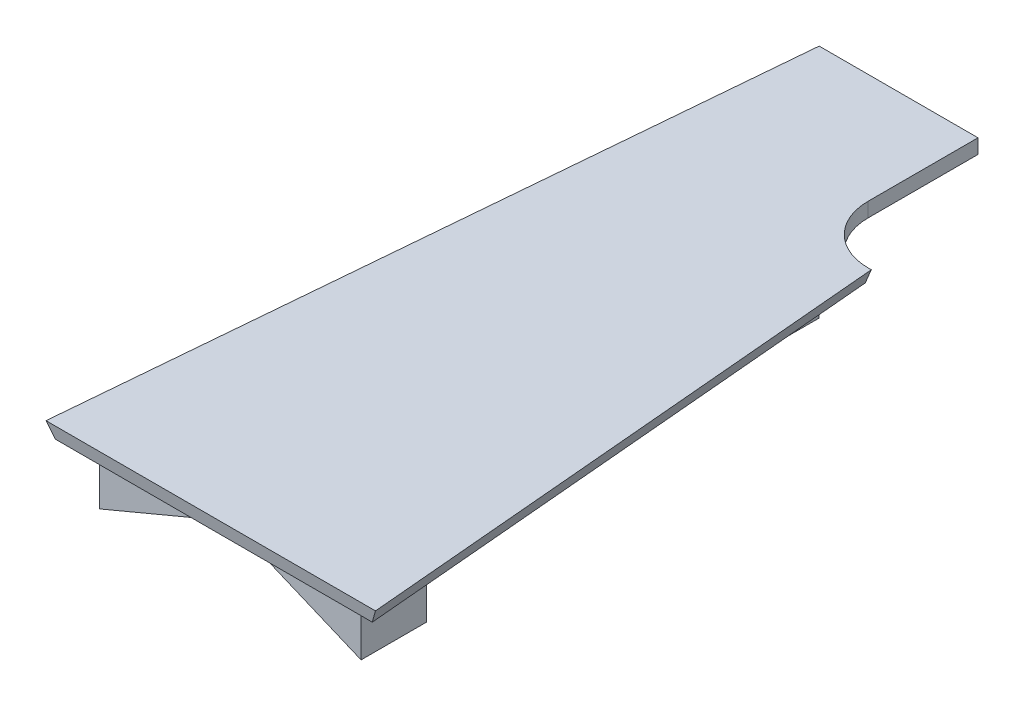
ISO-10303-21;
HEADER;
FILE_DESCRIPTION(('STEP AP214'),'2;1');
FILE_NAME('part.step','',(''),(''),'','','');
FILE_SCHEMA(('AUTOMOTIVE_DESIGN { 1 0 10303 214 1 1 1 1 }'));
ENDSEC;
DATA;
#1=APPLICATION_CONTEXT('core data for automotive mechanical design processes');
#2=APPLICATION_PROTOCOL_DEFINITION('international standard','automotive_design',2000,#1);
#3=PRODUCT_CONTEXT('',#1,'mechanical');
#4=PRODUCT('Part','Part','',(#3));
#5=PRODUCT_RELATED_PRODUCT_CATEGORY('part','',(#4));
#6=PRODUCT_DEFINITION_FORMATION('','',#4);
#7=PRODUCT_DEFINITION_CONTEXT('part definition',#1,'design');
#8=PRODUCT_DEFINITION('design','',#6,#7);
#9=PRODUCT_DEFINITION_SHAPE('','',#8);
#10=(LENGTH_UNIT() NAMED_UNIT(*) SI_UNIT(.MILLI.,.METRE.));
#11=(NAMED_UNIT(*) PLANE_ANGLE_UNIT() SI_UNIT($,.RADIAN.));
#12=(NAMED_UNIT(*) SI_UNIT($,.STERADIAN.) SOLID_ANGLE_UNIT());
#13=UNCERTAINTY_MEASURE_WITH_UNIT(LENGTH_MEASURE(1.E-05),#10,'distance_accuracy_value','');
#14=(GEOMETRIC_REPRESENTATION_CONTEXT(3) GLOBAL_UNCERTAINTY_ASSIGNED_CONTEXT((#13)) GLOBAL_UNIT_ASSIGNED_CONTEXT((#10,
#11,#12)) REPRESENTATION_CONTEXT('',''));
#15=CARTESIAN_POINT('',(0.,0.,0.));
#16=DIRECTION('',(0.,0.,1.));
#17=DIRECTION('',(1.,0.,0.));
#18=AXIS2_PLACEMENT_3D('',#15,#16,#17);
#19=CARTESIAN_POINT('',(18.0118217823983,-5.,-25.7361816822361));
#20=DIRECTION('',(0.,0.,1.));
#21=DIRECTION('',(1.,0.,0.));
#22=AXIS2_PLACEMENT_3D('',#19,#20,#21);
#23=PLANE('',#22);
#24=DIRECTION('',(0.,1.,0.));
#25=VECTOR('',#24,1.);
#26=CARTESIAN_POINT('',(18.0118217823983,-5.,-25.7361816822361));
#27=LINE('',#26,#25);
#28=CARTESIAN_POINT('',(18.0118217823983,-2.5,-25.7361816822361));
#29=VERTEX_POINT('',#28);
#30=CARTESIAN_POINT('',(18.0118217823983,0.,-25.7361816822361));
#31=VERTEX_POINT('',#30);
#32=EDGE_CURVE('E320',#29,#31,#27,.T.);
#33=ORIENTED_EDGE('',*,*,#32,.F.);
#34=DIRECTION('',(0.974370064785236,-0.224951054343862,0.));
#35=VECTOR('',#34,1.);
#36=CARTESIAN_POINT('',(18.0118217823983,-2.5,-25.7361816822361));
#37=LINE('',#36,#35);
#38=CARTESIAN_POINT('',(7.18313209668774,0.,-25.7361816822361));
#39=VERTEX_POINT('',#38);
#40=EDGE_CURVE('E281',#39,#29,#37,.T.);
#41=ORIENTED_EDGE('',*,*,#40,.F.);
#42=DIRECTION('',(1.,0.,0.));
#43=VECTOR('',#42,1.);
#44=CARTESIAN_POINT('',(18.0118217823983,0.,-25.7361816822361));
#45=LINE('',#44,#43);
#46=EDGE_CURVE('E300',#39,#31,#45,.T.);
#47=ORIENTED_EDGE('',*,*,#46,.T.);
#48=EDGE_LOOP('',(#33,#41,#47));
#49=FACE_BOUND('',#48,.T.);
#50=ADVANCED_FACE('F46',(#49),#23,.F.);
#51=CARTESIAN_POINT('',(18.0118217823983,-5.,-15.2638183177639));
#52=DIRECTION('',(0.,0.,-1.));
#53=DIRECTION('',(-1.,0.,0.));
#54=AXIS2_PLACEMENT_3D('',#51,#52,#53);
#55=PLANE('',#54);
#56=DIRECTION('',(-1.,0.,0.));
#57=VECTOR('',#56,1.);
#58=CARTESIAN_POINT('',(18.0118217823983,0.,-15.2638183177639));
#59=LINE('',#58,#57);
#60=CARTESIAN_POINT('',(18.0118217823983,0.,-15.2638183177639));
#61=VERTEX_POINT('',#60);
#62=CARTESIAN_POINT('',(7.18313209668774,0.,-15.2638183177639));
#63=VERTEX_POINT('',#62);
#64=EDGE_CURVE('E310',#61,#63,#59,.T.);
#65=ORIENTED_EDGE('',*,*,#64,.T.);
#66=DIRECTION('',(0.974370064785236,-0.224951054343862,0.));
#67=VECTOR('',#66,1.);
#68=CARTESIAN_POINT('',(18.5597857158846,-2.62650744212604,-15.2638183177639));
#69=LINE('',#68,#67);
#70=CARTESIAN_POINT('',(18.0118217823983,-2.5,-15.2638183177639));
#71=VERTEX_POINT('',#70);
#72=EDGE_CURVE('E220',#63,#71,#69,.T.);
#73=ORIENTED_EDGE('',*,*,#72,.T.);
#74=DIRECTION('',(0.,1.,0.));
#75=VECTOR('',#74,1.);
#76=CARTESIAN_POINT('',(18.0118217823983,-5.,-15.2638183177639));
#77=LINE('',#76,#75);
#78=EDGE_CURVE('E317',#71,#61,#77,.T.);
#79=ORIENTED_EDGE('',*,*,#78,.T.);
#80=EDGE_LOOP('',(#65,#73,#79));
#81=FACE_BOUND('',#80,.T.);
#82=ADVANCED_FACE('F420',(#81),#55,.F.);
#83=CARTESIAN_POINT('',(0.,0.,0.));
#84=DIRECTION('',(0.,-1.,0.));
#85=DIRECTION('',(0.,0.,-1.));
#86=AXIS2_PLACEMENT_3D('',#83,#84,#85);
#87=PLANE('',#86);
#88=CARTESIAN_POINT('',(19.7388943863118,0.,-42.4943411366622));
#89=DIRECTION('',(0.,-1.,0.));
#90=DIRECTION('',(0.,0.,-1.));
#91=AXIS2_PLACEMENT_3D('',#88,#89,#90);
#92=CIRCLE('',#91,10.);
#93=CARTESIAN_POINT('',(19.2359640728574,0.,-32.5069960890628));
#94=VERTEX_POINT('',#93);
#95=CARTESIAN_POINT('',(9.73889438631176,0.,-42.4943411366622));
#96=VERTEX_POINT('',#95);
#97=EDGE_CURVE('E232',#94,#96,#92,.T.);
#98=ORIENTED_EDGE('',*,*,#97,.F.);
#99=DIRECTION('',(0.0871557427476548,0.,0.996194698091746));
#100=VECTOR('',#99,1.);
#101=CARTESIAN_POINT('',(16.3560646475477,0.,-65.4243971470463));
#102=LINE('',#101,#100);
#103=CARTESIAN_POINT('',(27.4140197990155,0.,60.9686085958249));
#104=VERTEX_POINT('',#103);
#105=EDGE_CURVE('E229',#94,#104,#102,.T.);
#106=ORIENTED_EDGE('',*,*,#105,.T.);
#107=DIRECTION('',(1.,0.,0.));
#108=VECTOR('',#107,1.);
#109=CARTESIAN_POINT('',(-28.5,0.,60.9686085958249));
#110=LINE('',#109,#108);
#111=CARTESIAN_POINT('',(-27.4140197990155,0.,60.968608595825));
#112=VERTEX_POINT('',#111);
#113=EDGE_CURVE('E209',#112,#104,#110,.T.);
#114=ORIENTED_EDGE('',*,*,#113,.F.);
#115=DIRECTION('',(-0.0871557427476618,0.,0.996194698091745));
#116=VECTOR('',#115,1.);
#117=CARTESIAN_POINT('',(-16.3560646475468,0.,-65.4243971470465));
#118=LINE('',#117,#116);
#119=CARTESIAN_POINT('',(-16.6994049090869,0.,-61.5));
#120=VERTEX_POINT('',#119);
#121=EDGE_CURVE('E370',#120,#112,#118,.T.);
#122=ORIENTED_EDGE('',*,*,#121,.F.);
#123=DIRECTION('',(-1.,0.,0.));
#124=VECTOR('',#123,1.);
#125=CARTESIAN_POINT('',(-28.5,0.,-61.5));
#126=LINE('',#125,#124);
#127=CARTESIAN_POINT('',(9.73889438631175,0.,-61.5));
#128=VERTEX_POINT('',#127);
#129=EDGE_CURVE('E202',#128,#120,#126,.T.);
#130=ORIENTED_EDGE('',*,*,#129,.F.);
#131=DIRECTION('',(0.,0.,-1.));
#132=VECTOR('',#131,1.);
#133=CARTESIAN_POINT('',(9.73889438631176,0.,0.));
#134=LINE('',#133,#132);
#135=EDGE_CURVE('E179',#96,#128,#134,.T.);
#136=ORIENTED_EDGE('',*,*,#135,.F.);
#137=EDGE_LOOP('',(#98,#106,#114,#122,#130,#136));
#138=FACE_BOUND('',#137,.T.);
#139=CARTESIAN_POINT('',(-7.18313209668769,0.,-15.2638183177639));
#140=VERTEX_POINT('',#139);
#141=CARTESIAN_POINT('',(-18.0118217823983,0.,-15.2638183177639));
#142=VERTEX_POINT('',#141);
#143=EDGE_CURVE('E309',#140,#142,#59,.T.);
#144=ORIENTED_EDGE('',*,*,#143,.F.);
#145=DIRECTION('',(0.,0.,-1.));
#146=VECTOR('',#145,1.);
#147=CARTESIAN_POINT('',(-7.18313209668769,0.,-13.7361816822361));
#148=LINE('',#147,#146);
#149=CARTESIAN_POINT('',(-7.18313209668768,0.,-25.7361816822361));
#150=VERTEX_POINT('',#149);
#151=EDGE_CURVE('E70',#140,#150,#148,.T.);
#152=ORIENTED_EDGE('',*,*,#151,.T.);
#153=CARTESIAN_POINT('',(-18.0118217823983,0.,-25.7361816822361));
#154=VERTEX_POINT('',#153);
#155=EDGE_CURVE('E301',#154,#150,#45,.T.);
#156=ORIENTED_EDGE('',*,*,#155,.F.);
#157=DIRECTION('',(0.,0.,-1.));
#158=VECTOR('',#157,1.);
#159=CARTESIAN_POINT('',(-18.0118217823983,0.,-15.2638183177639));
#160=LINE('',#159,#158);
#161=EDGE_CURVE('E289',#142,#154,#160,.T.);
#162=ORIENTED_EDGE('',*,*,#161,.F.);
#163=EDGE_LOOP('',(#144,#152,#156,#162));
#164=FACE_BOUND('',#163,.T.);
#165=DIRECTION('',(0.,0.,-1.));
#166=VECTOR('',#165,1.);
#167=CARTESIAN_POINT('',(7.18313209668774,0.,-13.7361816822361));
#168=LINE('',#167,#166);
#169=EDGE_CURVE('E290',#63,#39,#168,.T.);
#170=ORIENTED_EDGE('',*,*,#169,.F.);
#171=ORIENTED_EDGE('',*,*,#64,.F.);
#172=DIRECTION('',(0.,0.,1.));
#173=VECTOR('',#172,1.);
#174=CARTESIAN_POINT('',(18.0118217823983,0.,-15.2638183177639));
#175=LINE('',#174,#173);
#176=EDGE_CURVE('E305',#31,#61,#175,.T.);
#177=ORIENTED_EDGE('',*,*,#176,.F.);
#178=ORIENTED_EDGE('',*,*,#46,.F.);
#179=EDGE_LOOP('',(#170,#171,#177,#178));
#180=FACE_BOUND('',#179,.T.);
#181=DIRECTION('',(-1.,0.,0.));
#182=VECTOR('',#181,1.);
#183=CARTESIAN_POINT('',(22.6207372724238,0.,58.1089238494695));
#184=LINE('',#183,#182);
#185=CARTESIAN_POINT('',(0.,0.,58.1089238494695));
#186=VERTEX_POINT('',#185);
#187=CARTESIAN_POINT('',(-22.6207372724238,0.,58.1089238494695));
#188=VERTEX_POINT('',#187);
#189=EDGE_CURVE('E357',#186,#188,#184,.T.);
#190=ORIENTED_EDGE('',*,*,#189,.F.);
#191=CARTESIAN_POINT('',(22.6207372724238,0.,58.1089238494695));
#192=VERTEX_POINT('',#191);
#193=EDGE_CURVE('E358',#192,#186,#184,.T.);
#194=ORIENTED_EDGE('',*,*,#193,.F.);
#195=DIRECTION('',(0.,0.,-1.));
#196=VECTOR('',#195,1.);
#197=CARTESIAN_POINT('',(22.6207372724238,0.,58.1089238494695));
#198=LINE('',#197,#196);
#199=CARTESIAN_POINT('',(22.6207372724238,0.,46.8282933421805));
#200=VERTEX_POINT('',#199);
#201=EDGE_CURVE('E362',#192,#200,#198,.T.);
#202=ORIENTED_EDGE('',*,*,#201,.T.);
#203=DIRECTION('',(-1.,0.,0.));
#204=VECTOR('',#203,1.);
#205=CARTESIAN_POINT('',(22.6207372724238,0.,46.8282933421805));
#206=LINE('',#205,#204);
#207=CARTESIAN_POINT('',(0.,0.,46.8282933421805));
#208=VERTEX_POINT('',#207);
#209=EDGE_CURVE('E349',#200,#208,#206,.T.);
#210=ORIENTED_EDGE('',*,*,#209,.T.);
#211=CARTESIAN_POINT('',(-22.6207372724238,0.,46.8282933421805));
#212=VERTEX_POINT('',#211);
#213=EDGE_CURVE('E348',#208,#212,#206,.T.);
#214=ORIENTED_EDGE('',*,*,#213,.T.);
#215=DIRECTION('',(0.,0.,-1.));
#216=VECTOR('',#215,1.);
#217=CARTESIAN_POINT('',(-22.6207372724238,0.,58.1089238494695));
#218=LINE('',#217,#216);
#219=EDGE_CURVE('E353',#188,#212,#218,.T.);
#220=ORIENTED_EDGE('',*,*,#219,.F.);
#221=EDGE_LOOP('',(#190,#194,#202,#210,#214,#220));
#222=FACE_BOUND('',#221,.T.);
#223=ADVANCED_FACE('F234',(#138,#164,#180,#222),#87,.T.);
#224=CARTESIAN_POINT('',(22.6207372724238,-13.,46.8282933421805));
#225=DIRECTION('',(0.,0.,-1.));
#226=DIRECTION('',(-1.,0.,0.));
#227=AXIS2_PLACEMENT_3D('',#224,#225,#226);
#228=PLANE('',#227);
#229=DIRECTION('',(0.922224559507283,-0.386654706219385,0.));
#230=VECTOR('',#229,1.);
#231=CARTESIAN_POINT('',(22.6207372724238,-9.48403990586399,46.8282933421805));
#232=LINE('',#231,#230);
#233=CARTESIAN_POINT('',(22.6207372724238,-9.48403990586399,46.8282933421805));
#234=VERTEX_POINT('',#233);
#235=EDGE_CURVE('E331',#208,#234,#232,.T.);
#236=ORIENTED_EDGE('',*,*,#235,.F.);
#237=ORIENTED_EDGE('',*,*,#209,.F.);
#238=DIRECTION('',(0.,1.,0.));
#239=VECTOR('',#238,1.);
#240=CARTESIAN_POINT('',(22.6207372724238,-13.,46.8282933421805));
#241=LINE('',#240,#239);
#242=EDGE_CURVE('E367',#234,#200,#241,.T.);
#243=ORIENTED_EDGE('',*,*,#242,.F.);
#244=EDGE_LOOP('',(#236,#237,#243));
#245=FACE_BOUND('',#244,.T.);
#246=ADVANCED_FACE('F416',(#245),#228,.T.);
#247=CARTESIAN_POINT('',(22.6207372724238,-13.,58.1089238494695));
#248=DIRECTION('',(0.,0.,-1.));
#249=DIRECTION('',(-1.,0.,0.));
#250=AXIS2_PLACEMENT_3D('',#247,#248,#249);
#251=PLANE('',#250);
#252=ORIENTED_EDGE('',*,*,#193,.T.);
#253=DIRECTION('',(0.922224559507282,-0.386654706219385,0.));
#254=VECTOR('',#253,1.);
#255=CARTESIAN_POINT('',(23.8744669935864,-10.0096824860981,58.1089238494695));
#256=LINE('',#255,#254);
#257=CARTESIAN_POINT('',(22.6207372724238,-9.48403990586399,58.1089238494695));
#258=VERTEX_POINT('',#257);
#259=EDGE_CURVE('E207',#186,#258,#256,.T.);
#260=ORIENTED_EDGE('',*,*,#259,.T.);
#261=DIRECTION('',(0.,1.,0.));
#262=VECTOR('',#261,1.);
#263=CARTESIAN_POINT('',(22.6207372724238,-13.,58.1089238494695));
#264=LINE('',#263,#262);
#265=EDGE_CURVE('E371',#258,#192,#264,.T.);
#266=ORIENTED_EDGE('',*,*,#265,.T.);
#267=EDGE_LOOP('',(#252,#260,#266));
#268=FACE_BOUND('',#267,.T.);
#269=ADVANCED_FACE('F694',(#268),#251,.F.);
#270=CARTESIAN_POINT('',(-28.5,2.5,-61.5));
#271=DIRECTION('',(0.,0.,1.));
#272=DIRECTION('',(1.,0.,0.));
#273=AXIS2_PLACEMENT_3D('',#270,#271,#272);
#274=PLANE('',#273);
#275=DIRECTION('',(-1.,0.,0.));
#276=VECTOR('',#275,1.);
#277=CARTESIAN_POINT('',(-28.5,2.5,-61.5));
#278=LINE('',#277,#276);
#279=CARTESIAN_POINT('',(9.73889438631175,2.5,-61.5));
#280=VERTEX_POINT('',#279);
#281=CARTESIAN_POINT('',(-17.7388943863109,2.5,-61.5));
#282=VERTEX_POINT('',#281);
#283=EDGE_CURVE('E191',#280,#282,#278,.T.);
#284=ORIENTED_EDGE('',*,*,#283,.F.);
#285=DIRECTION('',(0.,1.,0.));
#286=VECTOR('',#285,1.);
#287=CARTESIAN_POINT('',(9.73889438631175,-7.5,-61.5));
#288=LINE('',#287,#286);
#289=EDGE_CURVE('E172',#128,#280,#288,.T.);
#290=ORIENTED_EDGE('',*,*,#289,.F.);
#291=ORIENTED_EDGE('',*,*,#129,.T.);
#292=DIRECTION('',(-0.383930099614957,0.923362160048618,0.));
#293=VECTOR('',#292,1.);
#294=CARTESIAN_POINT('',(-19.3251063344954,6.31488216797659,-61.5));
#295=LINE('',#294,#293);
#296=EDGE_CURVE('E199',#120,#282,#295,.T.);
#297=ORIENTED_EDGE('',*,*,#296,.T.);
#298=EDGE_LOOP('',(#284,#290,#291,#297));
#299=FACE_BOUND('',#298,.T.);
#300=ADVANCED_FACE('F48',(#299),#274,.F.);
#301=CARTESIAN_POINT('',(0.,2.5,0.));
#302=DIRECTION('',(0.,-1.,0.));
#303=DIRECTION('',(0.,0.,-1.));
#304=AXIS2_PLACEMENT_3D('',#301,#302,#303);
#305=PLANE('',#304);
#306=DIRECTION('',(0.0871557427476548,0.,0.996194698091746));
#307=VECTOR('',#306,1.);
#308=CARTESIAN_POINT('',(28.5,2.5,61.5));
#309=LINE('',#308,#307);
#310=CARTESIAN_POINT('',(20.2759447942707,2.5,-32.5013811422857));
#311=VERTEX_POINT('',#310);
#312=CARTESIAN_POINT('',(28.5,2.5,61.5));
#313=VERTEX_POINT('',#312);
#314=EDGE_CURVE('E395',#311,#313,#309,.T.);
#315=ORIENTED_EDGE('',*,*,#314,.F.);
#316=DIRECTION('',(0.99988323356083,0.,-0.015281336457912));
#317=VECTOR('',#316,1.);
#318=CARTESIAN_POINT('',(19.8917077508907,2.5,-32.4955088010539));
#319=LINE('',#318,#317);
#320=CARTESIAN_POINT('',(19.8917077508907,2.5,-32.4955088010539));
#321=VERTEX_POINT('',#320);
#322=EDGE_CURVE('E185',#321,#311,#319,.T.);
#323=ORIENTED_EDGE('',*,*,#322,.F.);
#324=CARTESIAN_POINT('',(19.7388943863118,2.5,-42.4943411366622));
#325=DIRECTION('',(0.,1.,0.));
#326=DIRECTION('',(0.,0.,1.));
#327=AXIS2_PLACEMENT_3D('',#324,#325,#326);
#328=CIRCLE('',#327,10.);
#329=CARTESIAN_POINT('',(9.73889438631176,2.5,-42.4943411366622));
#330=VERTEX_POINT('',#329);
#331=EDGE_CURVE('E194',#330,#321,#328,.T.);
#332=ORIENTED_EDGE('',*,*,#331,.F.);
#333=DIRECTION('',(0.,0.,1.));
#334=VECTOR('',#333,1.);
#335=CARTESIAN_POINT('',(9.73889438631176,2.5,-42.5));
#336=LINE('',#335,#334);
#337=EDGE_CURVE('E176',#280,#330,#336,.T.);
#338=ORIENTED_EDGE('',*,*,#337,.F.);
#339=ORIENTED_EDGE('',*,*,#283,.T.);
#340=DIRECTION('',(0.0871557427476617,0.,-0.996194698091745));
#341=VECTOR('',#340,1.);
#342=CARTESIAN_POINT('',(-28.5,2.5,61.5));
#343=LINE('',#342,#341);
#344=CARTESIAN_POINT('',(-28.5,2.5,61.5));
#345=VERTEX_POINT('',#344);
#346=EDGE_CURVE('E396',#345,#282,#343,.T.);
#347=ORIENTED_EDGE('',*,*,#346,.F.);
#348=DIRECTION('',(1.,0.,0.));
#349=VECTOR('',#348,1.);
#350=CARTESIAN_POINT('',(-28.5,2.5,61.5));
#351=LINE('',#350,#349);
#352=EDGE_CURVE('E201',#345,#313,#351,.T.);
#353=ORIENTED_EDGE('',*,*,#352,.T.);
#354=EDGE_LOOP('',(#315,#323,#332,#338,#339,#347,#353));
#355=FACE_BOUND('',#354,.T.);
#356=ADVANCED_FACE('F189',(#355),#305,.F.);
#357=CARTESIAN_POINT('',(-28.5,0.,60.9686085958249));
#358=DIRECTION('',(0.,0.207911690817761,-0.978147600733805));
#359=DIRECTION('',(0.,0.978147600733805,0.207911690817761));
#360=AXIS2_PLACEMENT_3D('',#357,#358,#359);
#361=PLANE('',#360);
#362=ORIENTED_EDGE('',*,*,#352,.F.);
#363=DIRECTION('',(0.391062348992312,-0.900252022637708,-0.191354474568356));
#364=VECTOR('',#363,1.);
#365=CARTESIAN_POINT('',(-27.580098491385,0.382324401998462,61.0498741561563));
#366=LINE('',#365,#364);
#367=EDGE_CURVE('E383',#345,#112,#366,.T.);
#368=ORIENTED_EDGE('',*,*,#367,.T.);
#369=ORIENTED_EDGE('',*,*,#113,.T.);
#370=DIRECTION('',(0.391062348992305,0.900252022637711,0.191354474568357));
#371=VECTOR('',#370,1.);
#372=CARTESIAN_POINT('',(18.8631021258203,-19.6847918254948,56.7844769282076));
#373=LINE('',#372,#371);
#374=EDGE_CURVE('E391',#104,#313,#373,.T.);
#375=ORIENTED_EDGE('',*,*,#374,.T.);
#376=EDGE_LOOP('',(#362,#368,#369,#375));
#377=FACE_BOUND('',#376,.T.);
#378=ADVANCED_FACE('F401',(#377),#361,.F.);
#379=CARTESIAN_POINT('',(16.3560646475477,0.,-65.4243971470463));
#380=DIRECTION('',(-0.920363891963226,0.382683432365086,0.0805214068653775));
#381=DIRECTION('',(-0.383930099614951,-0.92336216004862,0.));
#382=AXIS2_PLACEMENT_3D('',#379,#380,#381);
#383=PLANE('',#382);
#384=CARTESIAN_POINT('',(19.7388943863118,3.3110238583597,-42.4943411366622));
#385=DIRECTION('',(-0.920363891963226,0.382683432365086,0.0805214068653775));
#386=DIRECTION('',(0.38122720636965,0.923879532511288,-0.033353058785001));
#387=AXIS2_PLACEMENT_3D('',#384,#385,#386);
#388=ELLIPSE('',#387,26.1312592975278,10.);
#389=CARTESIAN_POINT('',(19.8917077508907,1.57466401753848,-32.4955088010539));
#390=VERTEX_POINT('',#389);
#391=EDGE_CURVE('E55',#94,#390,#388,.T.);
#392=ORIENTED_EDGE('',*,*,#391,.T.);
#393=DIRECTION('',(0.383486285056457,0.923527974350572,-0.00586086730154773));
#394=VECTOR('',#393,1.);
#395=CARTESIAN_POINT('',(18.8880761824146,-0.842324191811896,-32.4801701783399));
#396=LINE('',#395,#394);
#397=EDGE_CURVE('E11',#390,#311,#396,.T.);
#398=ORIENTED_EDGE('',*,*,#397,.T.);
#399=ORIENTED_EDGE('',*,*,#314,.T.);
#400=ORIENTED_EDGE('',*,*,#374,.F.);
#401=ORIENTED_EDGE('',*,*,#105,.F.);
#402=EDGE_LOOP('',(#392,#398,#399,#400,#401));
#403=FACE_BOUND('',#402,.T.);
#404=ADVANCED_FACE('F227',(#403),#383,.F.);
#405=CARTESIAN_POINT('',(-17.3876580343312,2.5,-65.5146498737584));
#406=DIRECTION('',(0.920363891963223,0.382683432365092,0.0805214068653837));
#407=DIRECTION('',(-0.383930099614957,0.923362160048618,0.));
#408=AXIS2_PLACEMENT_3D('',#405,#406,#407);
#409=PLANE('',#408);
#410=ORIENTED_EDGE('',*,*,#121,.T.);
#411=ORIENTED_EDGE('',*,*,#367,.F.);
#412=ORIENTED_EDGE('',*,*,#346,.T.);
#413=ORIENTED_EDGE('',*,*,#296,.F.);
#414=EDGE_LOOP('',(#410,#411,#412,#413));
#415=FACE_BOUND('',#414,.T.);
#416=ADVANCED_FACE('F403',(#415),#409,.F.);
#417=DIRECTION('',(0.922224559507283,0.386654706219385,0.));
#418=VECTOR('',#417,1.);
#419=CARTESIAN_POINT('',(0.,0.,46.8282933421805));
#420=LINE('',#419,#418);
#421=CARTESIAN_POINT('',(-22.6207372724238,-9.48403990586399,46.8282933421805));
#422=VERTEX_POINT('',#421);
#423=EDGE_CURVE('E327',#422,#208,#420,.T.);
#424=ORIENTED_EDGE('',*,*,#423,.F.);
#425=DIRECTION('',(0.,1.,0.));
#426=VECTOR('',#425,1.);
#427=CARTESIAN_POINT('',(-22.6207372724238,-13.,46.8282933421805));
#428=LINE('',#427,#426);
#429=EDGE_CURVE('E366',#422,#212,#428,.T.);
#430=ORIENTED_EDGE('',*,*,#429,.T.);
#431=ORIENTED_EDGE('',*,*,#213,.F.);
#432=EDGE_LOOP('',(#424,#430,#431));
#433=FACE_BOUND('',#432,.T.);
#434=ADVANCED_FACE('F407',(#433),#228,.T.);
#435=CARTESIAN_POINT('',(22.6207372724238,-13.,58.1089238494695));
#436=DIRECTION('',(1.,0.,0.));
#437=DIRECTION('',(0.,0.,-1.));
#438=AXIS2_PLACEMENT_3D('',#435,#436,#437);
#439=PLANE('',#438);
#440=DIRECTION('',(0.,0.,-1.));
#441=VECTOR('',#440,1.);
#442=CARTESIAN_POINT('',(22.6207372724238,-9.48403990586399,66.8282933421805));
#443=LINE('',#442,#441);
#444=EDGE_CURVE('E335',#258,#234,#443,.T.);
#445=ORIENTED_EDGE('',*,*,#444,.T.);
#446=ORIENTED_EDGE('',*,*,#242,.T.);
#447=ORIENTED_EDGE('',*,*,#201,.F.);
#448=ORIENTED_EDGE('',*,*,#265,.F.);
#449=EDGE_LOOP('',(#445,#446,#447,#448));
#450=FACE_BOUND('',#449,.T.);
#451=ADVANCED_FACE('F413',(#450),#439,.T.);
#452=DIRECTION('',(0.,1.,0.));
#453=VECTOR('',#452,1.);
#454=CARTESIAN_POINT('',(-22.6207372724238,-13.,58.1089238494695));
#455=LINE('',#454,#453);
#456=CARTESIAN_POINT('',(-22.6207372724238,-9.48403990586399,58.1089238494695));
#457=VERTEX_POINT('',#456);
#458=EDGE_CURVE('E374',#457,#188,#455,.T.);
#459=ORIENTED_EDGE('',*,*,#458,.F.);
#460=DIRECTION('',(0.922224559507282,0.386654706219385,0.));
#461=VECTOR('',#460,1.);
#462=CARTESIAN_POINT('',(14.6033228743471,6.12263407821652,58.1089238494695));
#463=LINE('',#462,#461);
#464=EDGE_CURVE('E339',#457,#186,#463,.T.);
#465=ORIENTED_EDGE('',*,*,#464,.T.);
#466=ORIENTED_EDGE('',*,*,#189,.T.);
#467=EDGE_LOOP('',(#459,#465,#466));
#468=FACE_BOUND('',#467,.T.);
#469=ADVANCED_FACE('F705',(#468),#251,.F.);
#470=CARTESIAN_POINT('',(-22.6207372724238,-13.,58.1089238494695));
#471=DIRECTION('',(1.,0.,0.));
#472=DIRECTION('',(0.,0.,-1.));
#473=AXIS2_PLACEMENT_3D('',#470,#471,#472);
#474=PLANE('',#473);
#475=ORIENTED_EDGE('',*,*,#429,.F.);
#476=DIRECTION('',(0.,0.,-1.));
#477=VECTOR('',#476,1.);
#478=CARTESIAN_POINT('',(-22.6207372724238,-9.48403990586399,66.8282933421805));
#479=LINE('',#478,#477);
#480=EDGE_CURVE('E334',#457,#422,#479,.T.);
#481=ORIENTED_EDGE('',*,*,#480,.F.);
#482=ORIENTED_EDGE('',*,*,#458,.T.);
#483=ORIENTED_EDGE('',*,*,#219,.T.);
#484=EDGE_LOOP('',(#475,#481,#482,#483));
#485=FACE_BOUND('',#484,.T.);
#486=ADVANCED_FACE('F686',(#485),#474,.F.);
#487=CARTESIAN_POINT('',(22.6207372724238,-9.48403990586399,66.8282933421805));
#488=DIRECTION('',(0.386654706219385,0.922224559507283,0.));
#489=DIRECTION('',(-0.922224559507283,0.386654706219385,0.));
#490=AXIS2_PLACEMENT_3D('',#487,#488,#489);
#491=PLANE('',#490);
#492=DIRECTION('',(0.,0.,-1.));
#493=VECTOR('',#492,1.);
#494=CARTESIAN_POINT('',(0.,0.,66.8282933421805));
#495=LINE('',#494,#493);
#496=EDGE_CURVE('E340',#186,#208,#495,.T.);
#497=ORIENTED_EDGE('',*,*,#496,.T.);
#498=ORIENTED_EDGE('',*,*,#235,.T.);
#499=ORIENTED_EDGE('',*,*,#444,.F.);
#500=ORIENTED_EDGE('',*,*,#259,.F.);
#501=EDGE_LOOP('',(#497,#498,#499,#500));
#502=FACE_BOUND('',#501,.T.);
#503=ADVANCED_FACE('F677',(#502),#491,.F.);
#504=CARTESIAN_POINT('',(0.,0.,66.8282933421805));
#505=DIRECTION('',(-0.386654706219385,0.922224559507283,0.));
#506=DIRECTION('',(-0.922224559507283,-0.386654706219385,0.));
#507=AXIS2_PLACEMENT_3D('',#504,#505,#506);
#508=PLANE('',#507);
#509=ORIENTED_EDGE('',*,*,#480,.T.);
#510=ORIENTED_EDGE('',*,*,#423,.T.);
#511=ORIENTED_EDGE('',*,*,#496,.F.);
#512=ORIENTED_EDGE('',*,*,#464,.F.);
#513=EDGE_LOOP('',(#509,#510,#511,#512));
#514=FACE_BOUND('',#513,.T.);
#515=ADVANCED_FACE('F443',(#514),#508,.F.);
#516=CARTESIAN_POINT('',(-18.0118217823983,-5.,-15.2638183177639));
#517=DIRECTION('',(1.,0.,0.));
#518=DIRECTION('',(0.,0.,-1.));
#519=AXIS2_PLACEMENT_3D('',#516,#517,#518);
#520=PLANE('',#519);
#521=DIRECTION('',(0.,1.,0.));
#522=VECTOR('',#521,1.);
#523=CARTESIAN_POINT('',(-18.0118217823983,-5.,-25.7361816822361));
#524=LINE('',#523,#522);
#525=CARTESIAN_POINT('',(-18.0118217823983,-2.5,-25.7361816822361));
#526=VERTEX_POINT('',#525);
#527=EDGE_CURVE('E324',#526,#154,#524,.T.);
#528=ORIENTED_EDGE('',*,*,#527,.F.);
#529=DIRECTION('',(0.,0.,-1.));
#530=VECTOR('',#529,1.);
#531=CARTESIAN_POINT('',(-18.0118217823983,-2.5,-13.7361816822361));
#532=LINE('',#531,#530);
#533=CARTESIAN_POINT('',(-18.0118217823983,-2.5,-15.2638183177639));
#534=VERTEX_POINT('',#533);
#535=EDGE_CURVE('E284',#534,#526,#532,.T.);
#536=ORIENTED_EDGE('',*,*,#535,.F.);
#537=DIRECTION('',(0.,1.,0.));
#538=VECTOR('',#537,1.);
#539=CARTESIAN_POINT('',(-18.0118217823983,-5.,-15.2638183177639));
#540=LINE('',#539,#538);
#541=EDGE_CURVE('E314',#534,#142,#540,.T.);
#542=ORIENTED_EDGE('',*,*,#541,.T.);
#543=ORIENTED_EDGE('',*,*,#161,.T.);
#544=EDGE_LOOP('',(#528,#536,#542,#543));
#545=FACE_BOUND('',#544,.T.);
#546=ADVANCED_FACE('F436',(#545),#520,.F.);
#547=ORIENTED_EDGE('',*,*,#155,.T.);
#548=DIRECTION('',(0.974370064785236,0.224951054343861,0.));
#549=VECTOR('',#548,1.);
#550=CARTESIAN_POINT('',(-7.18313209668768,0.,-25.7361816822361));
#551=LINE('',#550,#549);
#552=EDGE_CURVE('E272',#526,#150,#551,.T.);
#553=ORIENTED_EDGE('',*,*,#552,.F.);
#554=ORIENTED_EDGE('',*,*,#527,.T.);
#555=EDGE_LOOP('',(#547,#553,#554));
#556=FACE_BOUND('',#555,.T.);
#557=ADVANCED_FACE('F423',(#556),#23,.F.);
#558=CARTESIAN_POINT('',(18.0118217823983,-5.,-15.2638183177639));
#559=DIRECTION('',(-1.,0.,0.));
#560=DIRECTION('',(0.,0.,1.));
#561=AXIS2_PLACEMENT_3D('',#558,#559,#560);
#562=PLANE('',#561);
#563=ORIENTED_EDGE('',*,*,#78,.F.);
#564=DIRECTION('',(0.,0.,-1.));
#565=VECTOR('',#564,1.);
#566=CARTESIAN_POINT('',(18.0118217823983,-2.5,-13.7361816822361));
#567=LINE('',#566,#565);
#568=EDGE_CURVE('E285',#71,#29,#567,.T.);
#569=ORIENTED_EDGE('',*,*,#568,.T.);
#570=ORIENTED_EDGE('',*,*,#32,.T.);
#571=ORIENTED_EDGE('',*,*,#176,.T.);
#572=EDGE_LOOP('',(#563,#569,#570,#571));
#573=FACE_BOUND('',#572,.T.);
#574=ADVANCED_FACE('F435',(#573),#562,.F.);
#575=ORIENTED_EDGE('',*,*,#541,.F.);
#576=DIRECTION('',(0.974370064785236,0.224951054343861,0.));
#577=VECTOR('',#576,1.);
#578=CARTESIAN_POINT('',(15.6409542475349,5.26935552838426,-15.2638183177639));
#579=LINE('',#578,#577);
#580=EDGE_CURVE('E217',#534,#140,#579,.T.);
#581=ORIENTED_EDGE('',*,*,#580,.T.);
#582=ORIENTED_EDGE('',*,*,#143,.T.);
#583=EDGE_LOOP('',(#575,#581,#582));
#584=FACE_BOUND('',#583,.T.);
#585=ADVANCED_FACE('F430',(#584),#55,.F.);
#586=CARTESIAN_POINT('',(18.0118217823983,-2.5,-13.7361816822361));
#587=DIRECTION('',(0.224951054343862,0.974370064785236,0.));
#588=DIRECTION('',(-0.974370064785236,0.224951054343862,0.));
#589=AXIS2_PLACEMENT_3D('',#586,#587,#588);
#590=PLANE('',#589);
#591=ORIENTED_EDGE('',*,*,#169,.T.);
#592=ORIENTED_EDGE('',*,*,#40,.T.);
#593=ORIENTED_EDGE('',*,*,#568,.F.);
#594=ORIENTED_EDGE('',*,*,#72,.F.);
#595=EDGE_LOOP('',(#591,#592,#593,#594));
#596=FACE_BOUND('',#595,.T.);
#597=ADVANCED_FACE('F466',(#596),#590,.F.);
#598=CARTESIAN_POINT('',(-7.18313209668769,0.,-13.7361816822361));
#599=DIRECTION('',(-0.224951054343861,0.974370064785236,0.));
#600=DIRECTION('',(-0.974370064785236,-0.224951054343861,0.));
#601=AXIS2_PLACEMENT_3D('',#598,#599,#600);
#602=PLANE('',#601);
#603=ORIENTED_EDGE('',*,*,#535,.T.);
#604=ORIENTED_EDGE('',*,*,#552,.T.);
#605=ORIENTED_EDGE('',*,*,#151,.F.);
#606=ORIENTED_EDGE('',*,*,#580,.F.);
#607=EDGE_LOOP('',(#603,#604,#605,#606));
#608=FACE_BOUND('',#607,.T.);
#609=ADVANCED_FACE('F452',(#608),#602,.F.);
#610=CARTESIAN_POINT('',(19.8917077508907,-7.5,-32.4955088010539));
#611=DIRECTION('',(0.015281336457912,0.,0.999883233560829));
#612=DIRECTION('',(0.999883233560829,0.,-0.015281336457912));
#613=AXIS2_PLACEMENT_3D('',#610,#611,#612);
#614=PLANE('',#613);
#615=DIRECTION('',(0.,1.,0.));
#616=VECTOR('',#615,1.);
#617=CARTESIAN_POINT('',(19.8917077508907,-7.5,-32.4955088010539));
#618=LINE('',#617,#616);
#619=EDGE_CURVE('E62',#390,#321,#618,.T.);
#620=ORIENTED_EDGE('',*,*,#619,.T.);
#621=ORIENTED_EDGE('',*,*,#322,.T.);
#622=ORIENTED_EDGE('',*,*,#397,.F.);
#623=EDGE_LOOP('',(#620,#621,#622));
#624=FACE_BOUND('',#623,.T.);
#625=ADVANCED_FACE('F473',(#624),#614,.F.);
#626=CARTESIAN_POINT('',(19.7388943863118,-7.5,-42.4943411366622));
#627=DIRECTION('',(0.,1.,0.));
#628=DIRECTION('',(0.,0.,1.));
#629=AXIS2_PLACEMENT_3D('',#626,#627,#628);
#630=CYLINDRICAL_SURFACE('',#629,10.);
#631=ORIENTED_EDGE('',*,*,#97,.T.);
#632=DIRECTION('',(0.,1.,0.));
#633=VECTOR('',#632,1.);
#634=CARTESIAN_POINT('',(9.73889438631176,-7.5,-42.4943411366622));
#635=LINE('',#634,#633);
#636=EDGE_CURVE('E184',#96,#330,#635,.T.);
#637=ORIENTED_EDGE('',*,*,#636,.T.);
#638=ORIENTED_EDGE('',*,*,#331,.T.);
#639=ORIENTED_EDGE('',*,*,#619,.F.);
#640=ORIENTED_EDGE('',*,*,#391,.F.);
#641=EDGE_LOOP('',(#631,#637,#638,#639,#640));
#642=FACE_BOUND('',#641,.T.);
#643=ADVANCED_FACE('F231',(#642),#630,.F.);
#644=CARTESIAN_POINT('',(9.73889438631176,-7.5,-42.5));
#645=DIRECTION('',(-1.,0.,0.));
#646=DIRECTION('',(0.,0.,1.));
#647=AXIS2_PLACEMENT_3D('',#644,#645,#646);
#648=PLANE('',#647);
#649=ORIENTED_EDGE('',*,*,#135,.T.);
#650=ORIENTED_EDGE('',*,*,#289,.T.);
#651=ORIENTED_EDGE('',*,*,#337,.T.);
#652=ORIENTED_EDGE('',*,*,#636,.F.);
#653=EDGE_LOOP('',(#649,#650,#651,#652));
#654=FACE_BOUND('',#653,.T.);
#655=ADVANCED_FACE('F174',(#654),#648,.F.);
#656=CLOSED_SHELL('',(#50,#82,#223,#246,#269,#300,#356,#378,#404,#416,#434,#451,#469,#486,#503,
#515,#546,#557,#574,#585,#597,#609,#625,#643,#655));
#657=CARTESIAN_POINT('',(12.597476939543,-0.5,-20.5));
#658=DIRECTION('',(0.,1.,0.));
#659=DIRECTION('',(0.,0.,1.));
#660=AXIS2_PLACEMENT_3D('',#657,#658,#659);
#661=CYLINDRICAL_SURFACE('',#660,3.1);
#662=CARTESIAN_POINT('',(12.597476939543,-0.5,-20.5));
#663=DIRECTION('',(0.,-1.,0.));
#664=DIRECTION('',(0.,0.,-1.));
#665=AXIS2_PLACEMENT_3D('',#662,#663,#664);
#666=CIRCLE('',#665,3.1);
#667=CARTESIAN_POINT('',(12.597476939543,-0.5,-23.6));
#668=VERTEX_POINT('',#667);
#669=EDGE_CURVE('E267',#668,#668,#666,.T.);
#670=ORIENTED_EDGE('',*,*,#669,.T.);
#671=EDGE_LOOP('',(#670));
#672=FACE_BOUND('',#671,.T.);
#673=CARTESIAN_POINT('',(12.597476939543,1.65,-20.5));
#674=DIRECTION('',(0.,-1.,0.));
#675=DIRECTION('',(0.,0.,-1.));
#676=AXIS2_PLACEMENT_3D('',#673,#674,#675);
#677=CIRCLE('',#676,3.1);
#678=CARTESIAN_POINT('',(12.597476939543,1.65,-23.6));
#679=VERTEX_POINT('',#678);
#680=EDGE_CURVE('E263',#679,#679,#677,.T.);
#681=ORIENTED_EDGE('',*,*,#680,.F.);
#682=EDGE_LOOP('',(#681));
#683=FACE_BOUND('',#682,.T.);
#684=ADVANCED_FACE('F490',(#672,#683),#661,.F.);
#685=CARTESIAN_POINT('',(12.597476939543,-0.5,-20.5));
#686=DIRECTION('',(0.,-1.,0.));
#687=DIRECTION('',(0.,0.,-1.));
#688=AXIS2_PLACEMENT_3D('',#685,#686,#687);
#689=PLANE('',#688);
#690=ORIENTED_EDGE('',*,*,#669,.F.);
#691=EDGE_LOOP('',(#690));
#692=FACE_BOUND('',#691,.T.);
#693=ADVANCED_FACE('F493',(#692),#689,.F.);
#694=CARTESIAN_POINT('',(12.597476939543,1.65,-20.5));
#695=DIRECTION('',(0.,-1.,0.));
#696=DIRECTION('',(0.,0.,-1.));
#697=AXIS2_PLACEMENT_3D('',#694,#695,#696);
#698=PLANE('',#697);
#699=ORIENTED_EDGE('',*,*,#680,.T.);
#700=EDGE_LOOP('',(#699));
#701=FACE_BOUND('',#700,.T.);
#702=ADVANCED_FACE('F498',(#701),#698,.T.);
#703=CLOSED_SHELL('',(#684,#693,#702));
#704=CARTESIAN_POINT('',(-12.597476939543,-0.5,-20.5));
#705=DIRECTION('',(0.,1.,0.));
#706=DIRECTION('',(0.,0.,1.));
#707=AXIS2_PLACEMENT_3D('',#704,#705,#706);
#708=CYLINDRICAL_SURFACE('',#707,3.1);
#709=CARTESIAN_POINT('',(-12.597476939543,-0.5,-20.5));
#710=DIRECTION('',(0.,-1.,0.));
#711=DIRECTION('',(0.,0.,-1.));
#712=AXIS2_PLACEMENT_3D('',#709,#710,#711);
#713=CIRCLE('',#712,3.1);
#714=CARTESIAN_POINT('',(-12.597476939543,-0.5,-23.6));
#715=VERTEX_POINT('',#714);
#716=EDGE_CURVE('E256',#715,#715,#713,.T.);
#717=ORIENTED_EDGE('',*,*,#716,.T.);
#718=EDGE_LOOP('',(#717));
#719=FACE_BOUND('',#718,.T.);
#720=CARTESIAN_POINT('',(-12.597476939543,1.65,-20.5));
#721=DIRECTION('',(0.,-1.,0.));
#722=DIRECTION('',(0.,0.,-1.));
#723=AXIS2_PLACEMENT_3D('',#720,#721,#722);
#724=CIRCLE('',#723,3.1);
#725=CARTESIAN_POINT('',(-12.597476939543,1.65,-23.6));
#726=VERTEX_POINT('',#725);
#727=EDGE_CURVE('E268',#726,#726,#724,.T.);
#728=ORIENTED_EDGE('',*,*,#727,.F.);
#729=EDGE_LOOP('',(#728));
#730=FACE_BOUND('',#729,.T.);
#731=ADVANCED_FACE('F485',(#719,#730),#708,.F.);
#732=CARTESIAN_POINT('',(-12.597476939543,-0.5,-20.5));
#733=DIRECTION('',(0.,-1.,0.));
#734=DIRECTION('',(0.,0.,-1.));
#735=AXIS2_PLACEMENT_3D('',#732,#733,#734);
#736=PLANE('',#735);
#737=ORIENTED_EDGE('',*,*,#716,.F.);
#738=EDGE_LOOP('',(#737));
#739=FACE_BOUND('',#738,.T.);
#740=ADVANCED_FACE('F479',(#739),#736,.F.);
#741=CARTESIAN_POINT('',(-12.597476939543,1.65,-20.5));
#742=DIRECTION('',(0.,-1.,0.));
#743=DIRECTION('',(0.,0.,-1.));
#744=AXIS2_PLACEMENT_3D('',#741,#742,#743);
#745=PLANE('',#744);
#746=ORIENTED_EDGE('',*,*,#727,.T.);
#747=EDGE_LOOP('',(#746));
#748=FACE_BOUND('',#747,.T.);
#749=ADVANCED_FACE('F476',(#748),#745,.T.);
#750=CLOSED_SHELL('',(#731,#740,#749));
#751=CARTESIAN_POINT('',(-16.9655529543178,-3.592019952932,52.468608595825));
#752=DIRECTION('',(0.,-1.,0.));
#753=DIRECTION('',(0.,0.,-1.));
#754=AXIS2_PLACEMENT_3D('',#751,#752,#753);
#755=CYLINDRICAL_SURFACE('',#754,3.1);
#756=CARTESIAN_POINT('',(-16.9655529543178,-3.592019952932,52.468608595825));
#757=DIRECTION('',(0.,1.,0.));
#758=DIRECTION('',(0.,0.,1.));
#759=AXIS2_PLACEMENT_3D('',#756,#757,#758);
#760=CIRCLE('',#759,3.1);
#761=CARTESIAN_POINT('',(-16.9655529543178,-3.592019952932,55.568608595825));
#762=VERTEX_POINT('',#761);
#763=EDGE_CURVE('E251',#762,#762,#760,.T.);
#764=ORIENTED_EDGE('',*,*,#763,.T.);
#765=EDGE_LOOP('',(#764));
#766=FACE_BOUND('',#765,.T.);
#767=CARTESIAN_POINT('',(-16.9655529543178,-5.742019952932,52.468608595825));
#768=DIRECTION('',(0.,1.,0.));
#769=DIRECTION('',(0.,0.,1.));
#770=AXIS2_PLACEMENT_3D('',#767,#768,#769);
#771=CIRCLE('',#770,3.1);
#772=CARTESIAN_POINT('',(-16.9655529543178,-5.742019952932,55.568608595825));
#773=VERTEX_POINT('',#772);
#774=EDGE_CURVE('E247',#773,#773,#771,.T.);
#775=ORIENTED_EDGE('',*,*,#774,.F.);
#776=EDGE_LOOP('',(#775));
#777=FACE_BOUND('',#776,.T.);
#778=ADVANCED_FACE('F517',(#766,#777),#755,.F.);
#779=CARTESIAN_POINT('',(-16.9655529543178,-3.592019952932,52.468608595825));
#780=DIRECTION('',(0.,1.,0.));
#781=DIRECTION('',(0.,0.,1.));
#782=AXIS2_PLACEMENT_3D('',#779,#780,#781);
#783=PLANE('',#782);
#784=ORIENTED_EDGE('',*,*,#763,.F.);
#785=EDGE_LOOP('',(#784));
#786=FACE_BOUND('',#785,.T.);
#787=ADVANCED_FACE('F520',(#786),#783,.F.);
#788=CARTESIAN_POINT('',(-16.9655529543178,-5.742019952932,52.468608595825));
#789=DIRECTION('',(0.,1.,0.));
#790=DIRECTION('',(0.,0.,1.));
#791=AXIS2_PLACEMENT_3D('',#788,#789,#790);
#792=PLANE('',#791);
#793=ORIENTED_EDGE('',*,*,#774,.T.);
#794=EDGE_LOOP('',(#793));
#795=FACE_BOUND('',#794,.T.);
#796=ADVANCED_FACE('F526',(#795),#792,.T.);
#797=CLOSED_SHELL('',(#778,#787,#796));
#798=CARTESIAN_POINT('',(16.9655529543178,-3.592019952932,52.468608595825));
#799=DIRECTION('',(0.,-1.,0.));
#800=DIRECTION('',(0.,0.,-1.));
#801=AXIS2_PLACEMENT_3D('',#798,#799,#800);
#802=CYLINDRICAL_SURFACE('',#801,3.1);
#803=CARTESIAN_POINT('',(16.9655529543178,-3.592019952932,52.468608595825));
#804=DIRECTION('',(0.,1.,0.));
#805=DIRECTION('',(0.,0.,1.));
#806=AXIS2_PLACEMENT_3D('',#803,#804,#805);
#807=CIRCLE('',#806,3.1);
#808=CARTESIAN_POINT('',(16.9655529543178,-3.592019952932,55.568608595825));
#809=VERTEX_POINT('',#808);
#810=EDGE_CURVE('E242',#809,#809,#807,.T.);
#811=ORIENTED_EDGE('',*,*,#810,.T.);
#812=EDGE_LOOP('',(#811));
#813=FACE_BOUND('',#812,.T.);
#814=CARTESIAN_POINT('',(16.9655529543178,-5.742019952932,52.468608595825));
#815=DIRECTION('',(0.,1.,0.));
#816=DIRECTION('',(0.,0.,1.));
#817=AXIS2_PLACEMENT_3D('',#814,#815,#816);
#818=CIRCLE('',#817,3.1);
#819=CARTESIAN_POINT('',(16.9655529543178,-5.742019952932,55.568608595825));
#820=VERTEX_POINT('',#819);
#821=EDGE_CURVE('E252',#820,#820,#818,.T.);
#822=ORIENTED_EDGE('',*,*,#821,.F.);
#823=EDGE_LOOP('',(#822));
#824=FACE_BOUND('',#823,.T.);
#825=ADVANCED_FACE('F512',(#813,#824),#802,.F.);
#826=CARTESIAN_POINT('',(16.9655529543178,-3.592019952932,52.468608595825));
#827=DIRECTION('',(0.,1.,0.));
#828=DIRECTION('',(0.,0.,1.));
#829=AXIS2_PLACEMENT_3D('',#826,#827,#828);
#830=PLANE('',#829);
#831=ORIENTED_EDGE('',*,*,#810,.F.);
#832=EDGE_LOOP('',(#831));
#833=FACE_BOUND('',#832,.T.);
#834=ADVANCED_FACE('F506',(#833),#830,.F.);
#835=CARTESIAN_POINT('',(16.9655529543178,-5.742019952932,52.468608595825));
#836=DIRECTION('',(0.,1.,0.));
#837=DIRECTION('',(0.,0.,1.));
#838=AXIS2_PLACEMENT_3D('',#835,#836,#837);
#839=PLANE('',#838);
#840=ORIENTED_EDGE('',*,*,#821,.T.);
#841=EDGE_LOOP('',(#840));
#842=FACE_BOUND('',#841,.T.);
#843=ADVANCED_FACE('F503',(#842),#839,.T.);
#844=CLOSED_SHELL('',(#825,#834,#843));
#845=ORIENTED_CLOSED_SHELL('',*,#703,.T.);
#846=ORIENTED_CLOSED_SHELL('',*,#750,.T.);
#847=ORIENTED_CLOSED_SHELL('',*,#797,.T.);
#848=ORIENTED_CLOSED_SHELL('',*,#844,.T.);
#849=BREP_WITH_VOIDS('B2',#656,(#845,#846,#847,#848));
#850=ADVANCED_BREP_SHAPE_REPRESENTATION('',(#18,#849),#14);
#851=SHAPE_DEFINITION_REPRESENTATION(#9,#850);
ENDSEC;
END-ISO-10303-21;
